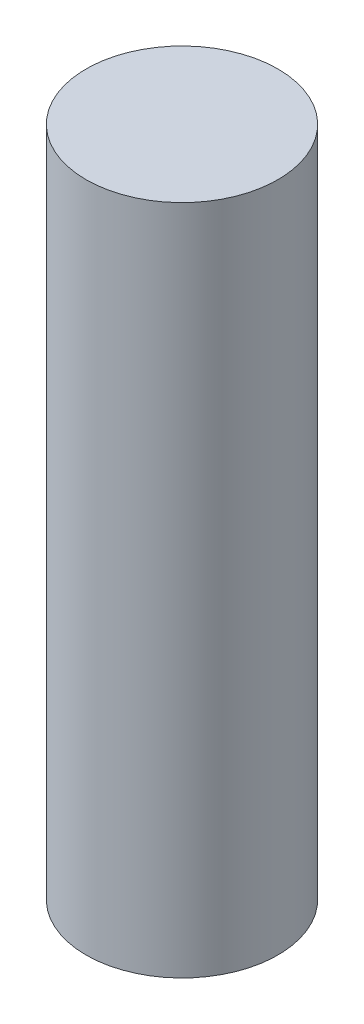
ISO-10303-21;
HEADER;
FILE_DESCRIPTION(('STEP AP214'),'2;1');
FILE_NAME('part.step','',(''),(''),'','','');
FILE_SCHEMA(('AUTOMOTIVE_DESIGN { 1 0 10303 214 1 1 1 1 }'));
ENDSEC;
DATA;
#1=APPLICATION_CONTEXT('core data for automotive mechanical design processes');
#2=APPLICATION_PROTOCOL_DEFINITION('international standard','automotive_design',2000,#1);
#3=PRODUCT_CONTEXT('',#1,'mechanical');
#4=PRODUCT('Part','Part','',(#3));
#5=PRODUCT_RELATED_PRODUCT_CATEGORY('part','',(#4));
#6=PRODUCT_DEFINITION_FORMATION('','',#4);
#7=PRODUCT_DEFINITION_CONTEXT('part definition',#1,'design');
#8=PRODUCT_DEFINITION('design','',#6,#7);
#9=PRODUCT_DEFINITION_SHAPE('','',#8);
#10=(LENGTH_UNIT() NAMED_UNIT(*) SI_UNIT(.MILLI.,.METRE.));
#11=(NAMED_UNIT(*) PLANE_ANGLE_UNIT() SI_UNIT($,.RADIAN.));
#12=(NAMED_UNIT(*) SI_UNIT($,.STERADIAN.) SOLID_ANGLE_UNIT());
#13=UNCERTAINTY_MEASURE_WITH_UNIT(LENGTH_MEASURE(1.E-05),#10,'distance_accuracy_value','');
#14=(GEOMETRIC_REPRESENTATION_CONTEXT(3) GLOBAL_UNCERTAINTY_ASSIGNED_CONTEXT((#13)) GLOBAL_UNIT_ASSIGNED_CONTEXT((#10,
#11,#12)) REPRESENTATION_CONTEXT('',''));
#15=CARTESIAN_POINT('',(0.,0.,0.));
#16=DIRECTION('',(0.,0.,1.));
#17=DIRECTION('',(1.,0.,0.));
#18=AXIS2_PLACEMENT_3D('',#15,#16,#17);
#19=CARTESIAN_POINT('',(0.,21.,0.));
#20=DIRECTION('',(0.,-1.,0.));
#21=DIRECTION('',(0.,0.,-1.));
#22=AXIS2_PLACEMENT_3D('',#19,#20,#21);
#23=CYLINDRICAL_SURFACE('',#22,3.);
#24=CARTESIAN_POINT('',(0.,21.,0.));
#25=DIRECTION('',(0.,1.,0.));
#26=DIRECTION('',(0.,0.,1.));
#27=AXIS2_PLACEMENT_3D('',#24,#25,#26);
#28=CIRCLE('',#27,3.);
#29=CARTESIAN_POINT('',(0.,21.,-3.));
#30=VERTEX_POINT('',#29);
#31=EDGE_CURVE('E10',#30,#30,#28,.T.);
#32=CARTESIAN_POINT('',(0.,0.,0.));
#33=DIRECTION('',(0.,1.,0.));
#34=DIRECTION('',(0.,0.,1.));
#35=AXIS2_PLACEMENT_3D('',#32,#33,#34);
#36=CIRCLE('',#35,3.);
#37=CARTESIAN_POINT('',(0.,0.,-3.));
#38=VERTEX_POINT('',#37);
#39=EDGE_CURVE('E40',#38,#38,#36,.T.);
#40=CARTESIAN_POINT('',(0.,21.,-3.));
#41=CARTESIAN_POINT('',(0.,20.78125,-3.));
#42=CARTESIAN_POINT('',(0.,20.5625,-3.));
#43=CARTESIAN_POINT('',(0.,20.125,-3.));
#44=CARTESIAN_POINT('',(0.,19.90625,-3.));
#45=CARTESIAN_POINT('',(0.,19.46875,-3.));
#46=CARTESIAN_POINT('',(0.,19.25,-3.));
#47=CARTESIAN_POINT('',(0.,18.8125,-3.));
#48=CARTESIAN_POINT('',(0.,18.59375,-3.));
#49=CARTESIAN_POINT('',(0.,18.15625,-3.));
#50=CARTESIAN_POINT('',(0.,17.9375,-3.));
#51=CARTESIAN_POINT('',(0.,17.5,-3.));
#52=CARTESIAN_POINT('',(0.,17.28125,-3.));
#53=CARTESIAN_POINT('',(0.,16.84375,-3.));
#54=CARTESIAN_POINT('',(0.,16.625,-3.));
#55=CARTESIAN_POINT('',(0.,16.1875,-3.));
#56=CARTESIAN_POINT('',(0.,15.96875,-3.));
#57=CARTESIAN_POINT('',(0.,15.53125,-3.));
#58=CARTESIAN_POINT('',(0.,15.3125,-3.));
#59=CARTESIAN_POINT('',(0.,14.875,-3.));
#60=CARTESIAN_POINT('',(0.,14.65625,-3.));
#61=CARTESIAN_POINT('',(0.,14.21875,-3.));
#62=CARTESIAN_POINT('',(0.,14.,-3.));
#63=CARTESIAN_POINT('',(0.,13.5625,-3.));
#64=CARTESIAN_POINT('',(0.,13.34375,-3.));
#65=CARTESIAN_POINT('',(0.,12.90625,-3.));
#66=CARTESIAN_POINT('',(0.,12.6875,-3.));
#67=CARTESIAN_POINT('',(0.,12.25,-3.));
#68=CARTESIAN_POINT('',(0.,12.03125,-3.));
#69=CARTESIAN_POINT('',(0.,11.59375,-3.));
#70=CARTESIAN_POINT('',(0.,11.375,-3.));
#71=CARTESIAN_POINT('',(0.,10.9375,-3.));
#72=CARTESIAN_POINT('',(0.,10.71875,-3.));
#73=CARTESIAN_POINT('',(0.,10.28125,-3.));
#74=CARTESIAN_POINT('',(0.,10.0625,-3.));
#75=CARTESIAN_POINT('',(0.,9.625,-3.));
#76=CARTESIAN_POINT('',(0.,9.40625,-3.));
#77=CARTESIAN_POINT('',(0.,8.96875,-3.));
#78=CARTESIAN_POINT('',(0.,8.75,-3.));
#79=CARTESIAN_POINT('',(0.,8.3125,-3.));
#80=CARTESIAN_POINT('',(0.,8.09375,-3.));
#81=CARTESIAN_POINT('',(0.,7.65625,-3.));
#82=CARTESIAN_POINT('',(0.,7.4375,-3.));
#83=CARTESIAN_POINT('',(0.,7.,-3.));
#84=CARTESIAN_POINT('',(0.,6.78125,-3.));
#85=CARTESIAN_POINT('',(0.,6.34375,-3.));
#86=CARTESIAN_POINT('',(0.,6.125,-3.));
#87=CARTESIAN_POINT('',(0.,5.6875,-3.));
#88=CARTESIAN_POINT('',(0.,5.46875,-3.));
#89=CARTESIAN_POINT('',(0.,5.03125,-3.));
#90=CARTESIAN_POINT('',(0.,4.8125,-3.));
#91=CARTESIAN_POINT('',(0.,4.375,-3.));
#92=CARTESIAN_POINT('',(0.,4.15625,-3.));
#93=CARTESIAN_POINT('',(0.,3.71875,-3.));
#94=CARTESIAN_POINT('',(0.,3.5,-3.));
#95=CARTESIAN_POINT('',(0.,3.0625,-3.));
#96=CARTESIAN_POINT('',(0.,2.84375,-3.));
#97=CARTESIAN_POINT('',(0.,2.40625,-3.));
#98=CARTESIAN_POINT('',(0.,2.1875,-3.));
#99=CARTESIAN_POINT('',(0.,1.75,-3.));
#100=CARTESIAN_POINT('',(0.,1.53125,-3.));
#101=CARTESIAN_POINT('',(0.,1.09375,-3.));
#102=CARTESIAN_POINT('',(0.,0.875000000000001,-3.));
#103=CARTESIAN_POINT('',(0.,0.4375,-3.));
#104=CARTESIAN_POINT('',(0.,0.21875,-3.));
#105=CARTESIAN_POINT('',(0.,0.,-3.));
#106=B_SPLINE_CURVE_WITH_KNOTS('',3,(#40,#41,#42,#43,#44,#45,#46,#47,#48,#49,#50,#51,#52,#53,
#54,#55,#56,#57,#58,#59,#60,#61,#62,#63,#64,#65,#66,#67,#68,#69,#70,#71,#72,#73,#74,#75,#76,#77,
#78,#79,#80,#81,#82,#83,#84,#85,#86,#87,#88,#89,#90,#91,#92,#93,#94,#95,#96,#97,#98,#99,#100,
#101,#102,#103,#104,#105),.UNSPECIFIED.,.F.,.F.,(4,2,2,2,2,2,2,2,2,2,2,2,2,2,2,2,2,2,2,2,2,2,2,
2,2,2,2,2,2,2,2,2,4),(0.,0.656249999999997,1.3125,1.96875,2.625,3.28125,3.9375,4.59375,5.25,
5.90625,6.5625,7.21875,7.875,8.53125,9.1875,9.84375,10.5,11.15625,11.8125,12.46875,13.125,
13.78125,14.4375,15.09375,15.75,16.40625,17.0625,17.71875,18.375,19.03125,19.6875,20.34375,21.),.UNSPECIFIED.);
#107=EDGE_CURVE('BSEAM37',#30,#38,#106,.T.);
#108=ORIENTED_EDGE('',*,*,#31,.F.);
#109=ORIENTED_EDGE('',*,*,#39,.T.);
#110=ORIENTED_EDGE('',*,*,#107,.T.);
#111=ORIENTED_EDGE('',*,*,#107,.F.);
#112=EDGE_LOOP('',(#108,#110,#109,#111));
#113=FACE_BOUND('',#112,.T.);
#114=ADVANCED_FACE('F37',(#113),#23,.T.);
#115=CARTESIAN_POINT('',(0.,21.,0.));
#116=DIRECTION('',(0.,1.,0.));
#117=DIRECTION('',(0.,0.,1.));
#118=AXIS2_PLACEMENT_3D('',#115,#116,#117);
#119=PLANE('',#118);
#120=ORIENTED_EDGE('',*,*,#31,.T.);
#121=EDGE_LOOP('',(#120));
#122=FACE_BOUND('',#121,.T.);
#123=ADVANCED_FACE('F54',(#122),#119,.T.);
#124=CARTESIAN_POINT('',(0.,0.,0.));
#125=DIRECTION('',(0.,1.,0.));
#126=DIRECTION('',(0.,0.,1.));
#127=AXIS2_PLACEMENT_3D('',#124,#125,#126);
#128=PLANE('',#127);
#129=ORIENTED_EDGE('',*,*,#39,.F.);
#130=EDGE_LOOP('',(#129));
#131=FACE_BOUND('',#130,.T.);
#132=ADVANCED_FACE('F52',(#131),#128,.F.);
#133=CLOSED_SHELL('',(#114,#123,#132));
#134=MANIFOLD_SOLID_BREP('B2',#133);
#135=ADVANCED_BREP_SHAPE_REPRESENTATION('',(#18,#134),#14);
#136=SHAPE_DEFINITION_REPRESENTATION(#9,#135);
ENDSEC;
END-ISO-10303-21;
